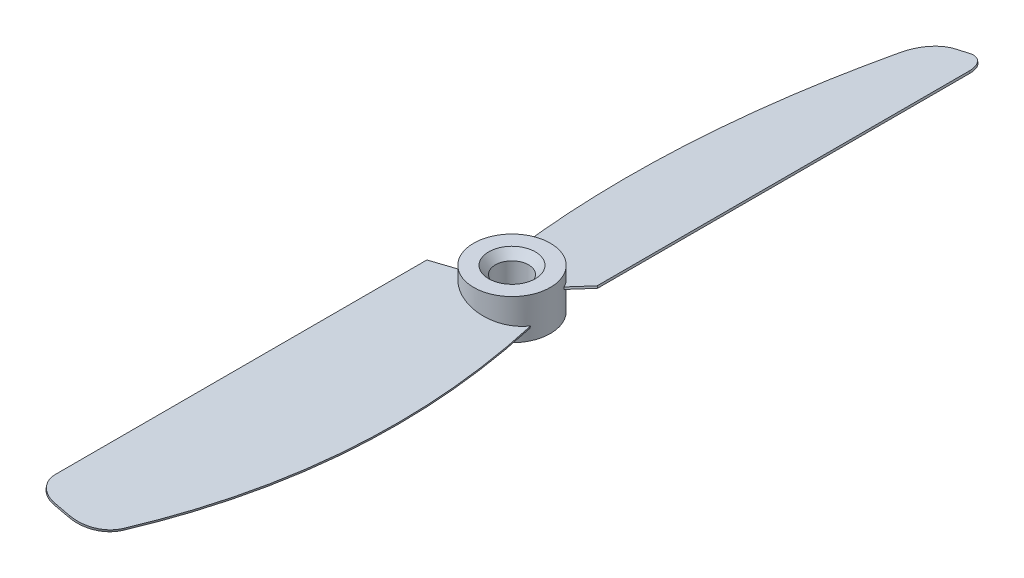
ISO-10303-21;
HEADER;
FILE_DESCRIPTION(('STEP AP214'),'2;1');
FILE_NAME('part.step','',(''),(''),'','','');
FILE_SCHEMA(('AUTOMOTIVE_DESIGN { 1 0 10303 214 1 1 1 1 }'));
ENDSEC;
DATA;
#1=APPLICATION_CONTEXT('core data for automotive mechanical design processes');
#2=APPLICATION_PROTOCOL_DEFINITION('international standard','automotive_design',2000,#1);
#3=PRODUCT_CONTEXT('',#1,'mechanical');
#4=PRODUCT('Part','Part','',(#3));
#5=PRODUCT_RELATED_PRODUCT_CATEGORY('part','',(#4));
#6=PRODUCT_DEFINITION_FORMATION('','',#4);
#7=PRODUCT_DEFINITION_CONTEXT('part definition',#1,'design');
#8=PRODUCT_DEFINITION('design','',#6,#7);
#9=PRODUCT_DEFINITION_SHAPE('','',#8);
#10=(LENGTH_UNIT() NAMED_UNIT(*) SI_UNIT(.MILLI.,.METRE.));
#11=(NAMED_UNIT(*) PLANE_ANGLE_UNIT() SI_UNIT($,.RADIAN.));
#12=(NAMED_UNIT(*) SI_UNIT($,.STERADIAN.) SOLID_ANGLE_UNIT());
#13=UNCERTAINTY_MEASURE_WITH_UNIT(LENGTH_MEASURE(1.E-05),#10,'distance_accuracy_value','');
#14=(GEOMETRIC_REPRESENTATION_CONTEXT(3) GLOBAL_UNCERTAINTY_ASSIGNED_CONTEXT((#13)) GLOBAL_UNIT_ASSIGNED_CONTEXT((#10,
#11,#12)) REPRESENTATION_CONTEXT('',''));
#15=CARTESIAN_POINT('',(0.,0.,0.));
#16=DIRECTION('',(0.,0.,1.));
#17=DIRECTION('',(1.,0.,0.));
#18=AXIS2_PLACEMENT_3D('',#15,#16,#17);
#19=CARTESIAN_POINT('',(0.,3.,0.));
#20=DIRECTION('',(0.,-1.,0.));
#21=DIRECTION('',(0.,0.,-1.));
#22=AXIS2_PLACEMENT_3D('',#19,#20,#21);
#23=CYLINDRICAL_SURFACE('',#22,5.75);
#24=CARTESIAN_POINT('',(-5.17321103617593,-1.34827549040175,-2.51005728524023));
#25=CARTESIAN_POINT('',(-5.18130724528555,-1.2987339238361,-2.49337560840791));
#26=CARTESIAN_POINT('',(-5.18936428493646,-1.24923107345242,-2.47656237967741));
#27=CARTESIAN_POINT('',(-5.20540002532086,-1.15030280504898,-2.44267281842004));
#28=CARTESIAN_POINT('',(-5.21337872605434,-1.10087738702923,-2.42559648589317));
#29=CARTESIAN_POINT('',(-5.22131825732912,-1.05149068519144,-2.40838860146813));
#30=B_SPLINE_CURVE_WITH_KNOTS('',3,(#24,#25,#26,#27,#28,#29),.UNSPECIFIED.,.F.,.F.,(4,2,4),(0.,
0.158692138114995,0.317384276229991),.UNSPECIFIED.);
#31=CARTESIAN_POINT('',(-5.17321103617593,-1.34827549040175,-2.51005728524023));
#32=VERTEX_POINT('',#31);
#33=CARTESIAN_POINT('',(-5.22131825732912,-1.05149068519145,-2.40838860146812));
#34=VERTEX_POINT('',#33);
#35=EDGE_CURVE('E51',#32,#34,#30,.T.);
#36=ORIENTED_EDGE('',*,*,#35,.F.);
#37=CARTESIAN_POINT('',(0.,-0.153945616169009,0.));
#38=DIRECTION('',(0.224951054343865,-0.974370064785235,0.));
#39=DIRECTION('',(-0.974370064785235,-0.224951054343865,0.));
#40=AXIS2_PLACEMENT_3D('',#37,#38,#39);
#41=ELLIPSE('',#40,5.901248619812,5.75);
#42=CARTESIAN_POINT('',(5.05271900090288,1.0125664798352,-2.74454562685976));
#43=VERTEX_POINT('',#42);
#44=EDGE_CURVE('E55',#32,#43,#41,.T.);
#45=ORIENTED_EDGE('',*,*,#44,.T.);
#46=CARTESIAN_POINT('',(0.,3.23855381107545,0.));
#47=DIRECTION('',(-0.513786863022175,-0.118617043690007,-0.849678207518632));
#48=DIRECTION('',(0.0613771970501858,-0.992940077218279,0.101502919839873));
#49=AXIS2_PLACEMENT_3D('',#46,#47,#48);
#50=ELLIPSE('',#49,48.4753271631605,5.75);
#51=CARTESIAN_POINT('',(5.0352757947948,1.31643063073162,-2.77641813680029));
#52=VERTEX_POINT('',#51);
#53=EDGE_CURVE('E214',#52,#43,#50,.T.);
#54=ORIENTED_EDGE('',*,*,#53,.F.);
#55=CARTESIAN_POINT('',(0.,0.153945616169009,0.));
#56=DIRECTION('',(0.224951054343865,-0.974370064785235,0.));
#57=DIRECTION('',(-0.974370064785235,-0.224951054343865,0.));
#58=AXIS2_PLACEMENT_3D('',#55,#56,#57);
#59=ELLIPSE('',#58,5.901248619812,5.75);
#60=EDGE_CURVE('E396',#34,#52,#59,.T.);
#61=ORIENTED_EDGE('',*,*,#60,.F.);
#62=EDGE_LOOP('',(#36,#45,#54,#61));
#63=FACE_BOUND('',#62,.T.);
#64=CARTESIAN_POINT('',(5.17321103617593,-1.34827549040175,2.51005728524023));
#65=CARTESIAN_POINT('',(5.18130724528555,-1.2987339238361,2.49337560840791));
#66=CARTESIAN_POINT('',(5.18936428493646,-1.24923107345242,2.47656237967741));
#67=CARTESIAN_POINT('',(5.20540002532086,-1.15030280504898,2.44267281842004));
#68=CARTESIAN_POINT('',(5.21337872605434,-1.10087738702923,2.42559648589317));
#69=CARTESIAN_POINT('',(5.22131825732912,-1.05149068519144,2.40838860146813));
#70=B_SPLINE_CURVE_WITH_KNOTS('',3,(#64,#65,#66,#67,#68,#69),.UNSPECIFIED.,.F.,.F.,(4,2,4),(0.,
0.158692138114995,0.317384276229991),.UNSPECIFIED.);
#71=CARTESIAN_POINT('',(5.17321103617593,-1.34827549040175,2.51005728524023));
#72=VERTEX_POINT('',#71);
#73=CARTESIAN_POINT('',(5.22131825732912,-1.05149068519145,2.40838860146812));
#74=VERTEX_POINT('',#73);
#75=EDGE_CURVE('E189',#72,#74,#70,.T.);
#76=ORIENTED_EDGE('',*,*,#75,.F.);
#77=CARTESIAN_POINT('',(0.,-0.153945616169009,0.));
#78=DIRECTION('',(-0.224951054343865,-0.974370064785235,0.));
#79=DIRECTION('',(0.974370064785235,-0.224951054343865,0.));
#80=AXIS2_PLACEMENT_3D('',#77,#78,#79);
#81=ELLIPSE('',#80,5.901248619812,5.75);
#82=CARTESIAN_POINT('',(-5.05271900090288,1.0125664798352,2.74454562685976));
#83=VERTEX_POINT('',#82);
#84=EDGE_CURVE('E198',#72,#83,#81,.T.);
#85=ORIENTED_EDGE('',*,*,#84,.T.);
#86=CARTESIAN_POINT('',(0.,3.23855381107545,0.));
#87=DIRECTION('',(0.513786863022175,-0.118617043690007,0.849678207518632));
#88=DIRECTION('',(-0.0613771970501858,-0.992940077218279,-0.101502919839873));
#89=AXIS2_PLACEMENT_3D('',#86,#87,#88);
#90=ELLIPSE('',#89,48.4753271631605,5.75);
#91=CARTESIAN_POINT('',(-5.0352757947948,1.31643063073162,2.77641813680029));
#92=VERTEX_POINT('',#91);
#93=EDGE_CURVE('E199',#92,#83,#90,.T.);
#94=ORIENTED_EDGE('',*,*,#93,.F.);
#95=CARTESIAN_POINT('',(0.,0.153945616169009,0.));
#96=DIRECTION('',(-0.224951054343865,-0.974370064785235,0.));
#97=DIRECTION('',(0.974370064785235,-0.224951054343865,0.));
#98=AXIS2_PLACEMENT_3D('',#95,#96,#97);
#99=ELLIPSE('',#98,5.901248619812,5.75);
#100=EDGE_CURVE('E322',#74,#92,#99,.T.);
#101=ORIENTED_EDGE('',*,*,#100,.F.);
#102=EDGE_LOOP('',(#76,#85,#94,#101));
#103=FACE_BOUND('',#102,.T.);
#104=CARTESIAN_POINT('',(0.,3.,0.));
#105=DIRECTION('',(0.,1.,0.));
#106=DIRECTION('',(0.,0.,1.));
#107=AXIS2_PLACEMENT_3D('',#104,#105,#106);
#108=CIRCLE('',#107,5.75);
#109=CARTESIAN_POINT('',(0.,3.,5.75));
#110=VERTEX_POINT('',#109);
#111=EDGE_CURVE('E320',#110,#110,#108,.T.);
#112=ORIENTED_EDGE('',*,*,#111,.F.);
#113=EDGE_LOOP('',(#112));
#114=FACE_BOUND('',#113,.T.);
#115=CARTESIAN_POINT('',(0.,-3.,0.));
#116=DIRECTION('',(0.,1.,0.));
#117=DIRECTION('',(0.,0.,1.));
#118=AXIS2_PLACEMENT_3D('',#115,#116,#117);
#119=CIRCLE('',#118,5.75);
#120=CARTESIAN_POINT('',(0.,-3.,5.75));
#121=VERTEX_POINT('',#120);
#122=EDGE_CURVE('E323',#121,#121,#119,.T.);
#123=ORIENTED_EDGE('',*,*,#122,.T.);
#124=EDGE_LOOP('',(#123));
#125=FACE_BOUND('',#124,.T.);
#126=ADVANCED_FACE('F36',(#63,#103,#114,#125),#23,.T.);
#127=CARTESIAN_POINT('',(0.,3.,0.));
#128=DIRECTION('',(0.,1.,0.));
#129=DIRECTION('',(0.,0.,1.));
#130=AXIS2_PLACEMENT_3D('',#127,#128,#129);
#131=PLANE('',#130);
#132=CARTESIAN_POINT('',(0.,3.,0.));
#133=DIRECTION('',(0.,1.,0.));
#134=DIRECTION('',(0.,0.,1.));
#135=AXIS2_PLACEMENT_3D('',#132,#133,#134);
#136=CIRCLE('',#135,3.49999999999999);
#137=CARTESIAN_POINT('',(0.,3.,3.49999999999999));
#138=VERTEX_POINT('',#137);
#139=EDGE_CURVE('E44',#138,#138,#136,.F.);
#140=ORIENTED_EDGE('',*,*,#139,.T.);
#141=EDGE_LOOP('',(#140));
#142=FACE_BOUND('',#141,.T.);
#143=ORIENTED_EDGE('',*,*,#111,.T.);
#144=EDGE_LOOP('',(#143));
#145=FACE_BOUND('',#144,.T.);
#146=ADVANCED_FACE('F186',(#142,#145),#131,.T.);
#147=CARTESIAN_POINT('',(0.,-3.,0.));
#148=DIRECTION('',(0.,1.,0.));
#149=DIRECTION('',(0.,0.,1.));
#150=AXIS2_PLACEMENT_3D('',#147,#148,#149);
#151=PLANE('',#150);
#152=CARTESIAN_POINT('',(0.,-3.,0.));
#153=DIRECTION('',(0.,1.,0.));
#154=DIRECTION('',(0.,0.,1.));
#155=AXIS2_PLACEMENT_3D('',#152,#153,#154);
#156=CIRCLE('',#155,3.69175359259423);
#157=CARTESIAN_POINT('',(0.,-3.,3.69175359259423));
#158=VERTEX_POINT('',#157);
#159=EDGE_CURVE('E11',#158,#158,#156,.T.);
#160=ORIENTED_EDGE('',*,*,#159,.T.);
#161=EDGE_LOOP('',(#160));
#162=FACE_BOUND('',#161,.T.);
#163=ORIENTED_EDGE('',*,*,#122,.F.);
#164=EDGE_LOOP('',(#163));
#165=FACE_BOUND('',#164,.T.);
#166=ADVANCED_FACE('F183',(#162,#165),#151,.F.);
#167=CARTESIAN_POINT('',(4.84553663689776,-1.27262589456224,0.848133107980154));
#168=CARTESIAN_POINT('',(10.9819459688261,-2.68932761703057,30.9060678712532));
#169=CARTESIAN_POINT('',(1.73622060139535,-0.554783725808093,59.9727073216359));
#170=B_SPLINE_CURVE_WITH_KNOTS('',2,(#167,#168,#169),.UNSPECIFIED.,.F.,.F.,(3,3),(0.,1.),.UNSPECIFIED.);
#171=DIRECTION('',(0.224951054343865,0.974370064785235,0.));
#172=VECTOR('',#171,1.);
#173=SURFACE_OF_LINEAR_EXTRUSION('',#170,#172);
#174=CARTESIAN_POINT('',(1.73622060139535,-0.554783725808092,59.9727073216359));
#175=VERTEX_POINT('',#174);
#176=EDGE_CURVE('E165',#72,#175,#170,.T.);
#177=ORIENTED_EDGE('',*,*,#176,.F.);
#178=ORIENTED_EDGE('',*,*,#75,.T.);
#179=CARTESIAN_POINT('',(4.91302195320092,-0.98031487512667,0.848133107980154));
#180=CARTESIAN_POINT('',(11.0494312851293,-2.397016597595,30.9060678712532));
#181=CARTESIAN_POINT('',(1.80370591769851,-0.262472706372522,59.9727073216359));
#182=B_SPLINE_CURVE_WITH_KNOTS('',2,(#179,#180,#181),.UNSPECIFIED.,.F.,.F.,(3,3),(0.,1.),.UNSPECIFIED.);
#183=CARTESIAN_POINT('',(1.80370591769851,-0.262472706372522,59.9727073216359));
#184=VERTEX_POINT('',#183);
#185=EDGE_CURVE('E157',#74,#184,#182,.T.);
#186=ORIENTED_EDGE('',*,*,#185,.T.);
#187=DIRECTION('',(0.224951054343865,0.974370064785235,0.));
#188=VECTOR('',#187,1.);
#189=CARTESIAN_POINT('',(1.73622060139535,-0.554783725808092,59.9727073216359));
#190=LINE('',#189,#188);
#191=EDGE_CURVE('E327',#175,#184,#190,.T.);
#192=ORIENTED_EDGE('',*,*,#191,.F.);
#193=EDGE_LOOP('',(#177,#178,#186,#192));
#194=FACE_BOUND('',#193,.T.);
#195=ADVANCED_FACE('F177',(#194),#173,.F.);
#196=CARTESIAN_POINT('',(-2.91950811093368,0.520075940378662,58.5));
#197=DIRECTION('',(0.224951054343865,0.974370064785235,0.));
#198=DIRECTION('',(-0.974370064785235,0.224951054343865,0.));
#199=AXIS2_PLACEMENT_3D('',#196,#197,#198);
#200=CYLINDRICAL_SURFACE('',#199,5.);
#201=CARTESIAN_POINT('',(-2.85202279463052,0.812386959814232,58.5));
#202=DIRECTION('',(-0.224951054343866,-0.974370064785235,0.));
#203=DIRECTION('',(0.974370064785235,-0.224951054343866,0.));
#204=AXIS2_PLACEMENT_3D('',#201,#202,#203);
#205=CIRCLE('',#204,5.);
#206=CARTESIAN_POINT('',(-2.85202279463053,0.812386959814233,63.5));
#207=VERTEX_POINT('',#206);
#208=EDGE_CURVE('E159',#184,#207,#205,.T.);
#209=ORIENTED_EDGE('',*,*,#208,.T.);
#210=DIRECTION('',(0.224951054343865,0.974370064785235,0.));
#211=VECTOR('',#210,1.);
#212=CARTESIAN_POINT('',(-2.91950811093368,0.520075940378662,63.5));
#213=LINE('',#212,#211);
#214=CARTESIAN_POINT('',(-2.91950811093368,0.520075940378662,63.5));
#215=VERTEX_POINT('',#214);
#216=EDGE_CURVE('E332',#215,#207,#213,.T.);
#217=ORIENTED_EDGE('',*,*,#216,.F.);
#218=CARTESIAN_POINT('',(-2.91950811093368,0.520075940378662,58.5));
#219=DIRECTION('',(-0.224951054343866,-0.974370064785235,0.));
#220=DIRECTION('',(0.974370064785235,-0.224951054343866,0.));
#221=AXIS2_PLACEMENT_3D('',#218,#219,#220);
#222=CIRCLE('',#221,5.);
#223=EDGE_CURVE('E170',#175,#215,#222,.T.);
#224=ORIENTED_EDGE('',*,*,#223,.F.);
#225=ORIENTED_EDGE('',*,*,#191,.T.);
#226=EDGE_LOOP('',(#209,#217,#224,#225));
#227=FACE_BOUND('',#226,.T.);
#228=ADVANCED_FACE('F182',(#227),#200,.T.);
#229=CARTESIAN_POINT('',(-5.20802828433935,1.04842245316719,63.5));
#230=DIRECTION('',(0.,0.,-1.));
#231=DIRECTION('',(-1.,0.,0.));
#232=AXIS2_PLACEMENT_3D('',#229,#230,#231);
#233=PLANE('',#232);
#234=DIRECTION('',(-0.974370064785235,0.224951054343865,0.));
#235=VECTOR('',#234,1.);
#236=CARTESIAN_POINT('',(-5.14054296803619,1.34073347260276,63.5));
#237=LINE('',#236,#235);
#238=CARTESIAN_POINT('',(-5.14054296803619,1.34073347260276,63.5));
#239=VERTEX_POINT('',#238);
#240=EDGE_CURVE('E351',#207,#239,#237,.T.);
#241=ORIENTED_EDGE('',*,*,#240,.T.);
#242=DIRECTION('',(0.224951054343865,0.974370064785235,0.));
#243=VECTOR('',#242,1.);
#244=CARTESIAN_POINT('',(-5.20802828433935,1.04842245316719,63.5));
#245=LINE('',#244,#243);
#246=CARTESIAN_POINT('',(-5.20802828433935,1.04842245316719,63.5));
#247=VERTEX_POINT('',#246);
#248=EDGE_CURVE('E335',#247,#239,#245,.T.);
#249=ORIENTED_EDGE('',*,*,#248,.F.);
#250=DIRECTION('',(-0.974370064785235,0.224951054343865,0.));
#251=VECTOR('',#250,1.);
#252=CARTESIAN_POINT('',(-5.20802828433935,1.04842245316719,63.5));
#253=LINE('',#252,#251);
#254=EDGE_CURVE('E364',#215,#247,#253,.T.);
#255=ORIENTED_EDGE('',*,*,#254,.F.);
#256=ORIENTED_EDGE('',*,*,#216,.T.);
#257=EDGE_LOOP('',(#241,#249,#255,#256));
#258=FACE_BOUND('',#257,.T.);
#259=ADVANCED_FACE('F377',(#258),#233,.F.);
#260=CARTESIAN_POINT('',(-5.20802828433937,1.04842245316719,60.5));
#261=DIRECTION('',(0.224951054343865,0.974370064785235,0.));
#262=DIRECTION('',(-0.974370064785235,0.224951054343865,0.));
#263=AXIS2_PLACEMENT_3D('',#260,#261,#262);
#264=CYLINDRICAL_SURFACE('',#263,3.);
#265=CARTESIAN_POINT('',(-5.14054296803621,1.34073347260276,60.5));
#266=DIRECTION('',(-0.224951054343866,-0.974370064785235,0.));
#267=DIRECTION('',(-0.974370064785235,0.224951054343866,0.));
#268=AXIS2_PLACEMENT_3D('',#265,#266,#267);
#269=CIRCLE('',#268,3.);
#270=CARTESIAN_POINT('',(-8.06365316239191,2.01558663563436,60.5));
#271=VERTEX_POINT('',#270);
#272=EDGE_CURVE('E349',#239,#271,#269,.T.);
#273=ORIENTED_EDGE('',*,*,#272,.T.);
#274=DIRECTION('',(0.224951054343865,0.974370064785235,0.));
#275=VECTOR('',#274,1.);
#276=CARTESIAN_POINT('',(-8.13113847869507,1.72327561619879,60.5));
#277=LINE('',#276,#275);
#278=CARTESIAN_POINT('',(-8.13113847869507,1.72327561619879,60.5));
#279=VERTEX_POINT('',#278);
#280=EDGE_CURVE('E338',#279,#271,#277,.T.);
#281=ORIENTED_EDGE('',*,*,#280,.F.);
#282=CARTESIAN_POINT('',(-5.20802828433937,1.04842245316719,60.5));
#283=DIRECTION('',(-0.224951054343866,-0.974370064785235,0.));
#284=DIRECTION('',(-0.974370064785235,0.224951054343866,0.));
#285=AXIS2_PLACEMENT_3D('',#282,#283,#284);
#286=CIRCLE('',#285,3.);
#287=EDGE_CURVE('E363',#247,#279,#286,.T.);
#288=ORIENTED_EDGE('',*,*,#287,.F.);
#289=ORIENTED_EDGE('',*,*,#248,.T.);
#290=EDGE_LOOP('',(#273,#281,#288,#289));
#291=FACE_BOUND('',#290,.T.);
#292=ADVANCED_FACE('F382',(#291),#264,.T.);
#293=CARTESIAN_POINT('',(-8.13113847869507,1.72327561619879,4.70523343607794));
#294=DIRECTION('',(0.974370064785235,-0.224951054343865,0.));
#295=DIRECTION('',(0.224951054343865,0.974370064785235,0.));
#296=AXIS2_PLACEMENT_3D('',#293,#294,#295);
#297=PLANE('',#296);
#298=DIRECTION('',(0.,0.,-1.));
#299=VECTOR('',#298,1.);
#300=CARTESIAN_POINT('',(-8.06365316239191,2.01558663563436,4.70523343607794));
#301=LINE('',#300,#299);
#302=CARTESIAN_POINT('',(-8.06365316239191,2.01558663563436,4.70523343607794));
#303=VERTEX_POINT('',#302);
#304=EDGE_CURVE('E347',#271,#303,#301,.T.);
#305=ORIENTED_EDGE('',*,*,#304,.T.);
#306=DIRECTION('',(0.224951054343865,0.974370064785235,0.));
#307=VECTOR('',#306,1.);
#308=CARTESIAN_POINT('',(-8.13113847869507,1.72327561619879,4.70523343607794));
#309=LINE('',#308,#307);
#310=CARTESIAN_POINT('',(-8.13113847869507,1.72327561619879,4.70523343607794));
#311=VERTEX_POINT('',#310);
#312=EDGE_CURVE('E341',#311,#303,#309,.T.);
#313=ORIENTED_EDGE('',*,*,#312,.F.);
#314=DIRECTION('',(0.,0.,-1.));
#315=VECTOR('',#314,1.);
#316=CARTESIAN_POINT('',(-8.13113847869507,1.72327561619879,4.70523343607794));
#317=LINE('',#316,#315);
#318=EDGE_CURVE('E361',#279,#311,#317,.T.);
#319=ORIENTED_EDGE('',*,*,#318,.F.);
#320=ORIENTED_EDGE('',*,*,#280,.T.);
#321=EDGE_LOOP('',(#305,#313,#319,#320));
#322=FACE_BOUND('',#321,.T.);
#323=ADVANCED_FACE('F387',(#322),#297,.F.);
#324=CARTESIAN_POINT('',(-4.37429716173756,0.85594045700703,2.31244940373139));
#325=DIRECTION('',(0.513786863022175,-0.118617043690007,0.849678207518632));
#326=DIRECTION('',(0.85571952126155,0.,-0.517439949107048));
#327=AXIS2_PLACEMENT_3D('',#324,#325,#326);
#328=PLANE('',#327);
#329=DIRECTION('',(0.827901010106532,-0.191136008634322,-0.527301568049939));
#330=VECTOR('',#329,1.);
#331=CARTESIAN_POINT('',(-4.3068118454344,1.1482514764426,2.31244940373139));
#332=LINE('',#331,#330);
#333=EDGE_CURVE('E171',#303,#92,#332,.T.);
#334=ORIENTED_EDGE('',*,*,#333,.T.);
#335=ORIENTED_EDGE('',*,*,#93,.T.);
#336=DIRECTION('',(0.827901010106532,-0.191136008634322,-0.527301568049939));
#337=VECTOR('',#336,1.);
#338=CARTESIAN_POINT('',(-4.37429716173756,0.85594045700703,2.31244940373139));
#339=LINE('',#338,#337);
#340=EDGE_CURVE('E344',#311,#83,#339,.T.);
#341=ORIENTED_EDGE('',*,*,#340,.F.);
#342=ORIENTED_EDGE('',*,*,#312,.T.);
#343=EDGE_LOOP('',(#334,#335,#341,#342));
#344=FACE_BOUND('',#343,.T.);
#345=ADVANCED_FACE('F392',(#344),#328,.F.);
#346=CARTESIAN_POINT('',(7.13641229398633,-1.80151621360787,30.6582440430306));
#347=DIRECTION('',(-0.224951054343865,-0.974370064785235,0.));
#348=DIRECTION('',(0.974370064785235,-0.224951054343865,0.));
#349=AXIS2_PLACEMENT_3D('',#346,#347,#348);
#350=PLANE('',#349);
#351=ORIENTED_EDGE('',*,*,#84,.F.);
#352=ORIENTED_EDGE('',*,*,#176,.T.);
#353=ORIENTED_EDGE('',*,*,#223,.T.);
#354=ORIENTED_EDGE('',*,*,#254,.T.);
#355=ORIENTED_EDGE('',*,*,#287,.T.);
#356=ORIENTED_EDGE('',*,*,#318,.T.);
#357=ORIENTED_EDGE('',*,*,#340,.T.);
#358=EDGE_LOOP('',(#351,#352,#353,#354,#355,#356,#357));
#359=FACE_BOUND('',#358,.T.);
#360=ADVANCED_FACE('F222',(#359),#350,.T.);
#361=CARTESIAN_POINT('',(7.20389761028949,-1.5092051941723,30.6582440430306));
#362=DIRECTION('',(-0.224951054343865,-0.974370064785235,0.));
#363=DIRECTION('',(0.974370064785235,-0.224951054343865,0.));
#364=AXIS2_PLACEMENT_3D('',#361,#362,#363);
#365=PLANE('',#364);
#366=ORIENTED_EDGE('',*,*,#185,.F.);
#367=ORIENTED_EDGE('',*,*,#100,.T.);
#368=ORIENTED_EDGE('',*,*,#333,.F.);
#369=ORIENTED_EDGE('',*,*,#304,.F.);
#370=ORIENTED_EDGE('',*,*,#272,.F.);
#371=ORIENTED_EDGE('',*,*,#240,.F.);
#372=ORIENTED_EDGE('',*,*,#208,.F.);
#373=EDGE_LOOP('',(#366,#367,#368,#369,#370,#371,#372));
#374=FACE_BOUND('',#373,.T.);
#375=ADVANCED_FACE('F220',(#374),#365,.F.);
#376=CARTESIAN_POINT('',(-4.84553663689776,-1.27262589456224,-0.848133107980154));
#377=CARTESIAN_POINT('',(-10.9819459688261,-2.68932761703057,-30.9060678712532));
#378=CARTESIAN_POINT('',(-1.73622060139535,-0.554783725808093,-59.9727073216359));
#379=B_SPLINE_CURVE_WITH_KNOTS('',2,(#376,#377,#378),.UNSPECIFIED.,.F.,.F.,(3,3),(0.,1.),.UNSPECIFIED.);
#380=DIRECTION('',(-0.224951054343865,0.974370064785235,0.));
#381=VECTOR('',#380,1.);
#382=SURFACE_OF_LINEAR_EXTRUSION('',#379,#381);
#383=CARTESIAN_POINT('',(-1.73622060139535,-0.554783725808092,-59.9727073216359));
#384=VERTEX_POINT('',#383);
#385=EDGE_CURVE('E134',#32,#384,#379,.T.);
#386=ORIENTED_EDGE('',*,*,#385,.F.);
#387=ORIENTED_EDGE('',*,*,#35,.T.);
#388=CARTESIAN_POINT('',(-4.91302195320092,-0.98031487512667,-0.848133107980154));
#389=CARTESIAN_POINT('',(-11.0494312851293,-2.397016597595,-30.9060678712532));
#390=CARTESIAN_POINT('',(-1.80370591769851,-0.262472706372522,-59.9727073216359));
#391=B_SPLINE_CURVE_WITH_KNOTS('',2,(#388,#389,#390),.UNSPECIFIED.,.F.,.F.,(3,3),(0.,1.),.UNSPECIFIED.);
#392=CARTESIAN_POINT('',(-1.80370591769851,-0.262472706372522,-59.9727073216359));
#393=VERTEX_POINT('',#392);
#394=EDGE_CURVE('E155',#34,#393,#391,.T.);
#395=ORIENTED_EDGE('',*,*,#394,.T.);
#396=DIRECTION('',(-0.224951054343865,0.974370064785235,0.));
#397=VECTOR('',#396,1.);
#398=CARTESIAN_POINT('',(-1.73622060139535,-0.554783725808092,-59.9727073216359));
#399=LINE('',#398,#397);
#400=EDGE_CURVE('E147',#384,#393,#399,.T.);
#401=ORIENTED_EDGE('',*,*,#400,.F.);
#402=EDGE_LOOP('',(#386,#387,#395,#401));
#403=FACE_BOUND('',#402,.T.);
#404=ADVANCED_FACE('F153',(#403),#382,.F.);
#405=CARTESIAN_POINT('',(2.91950811093368,0.520075940378662,-58.5));
#406=DIRECTION('',(-0.224951054343865,0.974370064785235,0.));
#407=DIRECTION('',(-0.974370064785235,-0.224951054343865,0.));
#408=AXIS2_PLACEMENT_3D('',#405,#406,#407);
#409=CYLINDRICAL_SURFACE('',#408,5.);
#410=CARTESIAN_POINT('',(2.85202279463052,0.812386959814232,-58.5));
#411=DIRECTION('',(0.224951054343866,-0.974370064785235,0.));
#412=DIRECTION('',(-0.974370064785235,-0.224951054343866,0.));
#413=AXIS2_PLACEMENT_3D('',#410,#411,#412);
#414=CIRCLE('',#413,5.);
#415=CARTESIAN_POINT('',(2.85202279463053,0.812386959814233,-63.5));
#416=VERTEX_POINT('',#415);
#417=EDGE_CURVE('E242',#393,#416,#414,.T.);
#418=ORIENTED_EDGE('',*,*,#417,.T.);
#419=DIRECTION('',(-0.224951054343865,0.974370064785235,0.));
#420=VECTOR('',#419,1.);
#421=CARTESIAN_POINT('',(2.91950811093368,0.520075940378662,-63.5));
#422=LINE('',#421,#420);
#423=CARTESIAN_POINT('',(2.91950811093368,0.520075940378662,-63.5));
#424=VERTEX_POINT('',#423);
#425=EDGE_CURVE('E149',#424,#416,#422,.T.);
#426=ORIENTED_EDGE('',*,*,#425,.F.);
#427=CARTESIAN_POINT('',(2.91950811093368,0.520075940378662,-58.5));
#428=DIRECTION('',(0.224951054343866,-0.974370064785235,0.));
#429=DIRECTION('',(-0.974370064785235,-0.224951054343866,0.));
#430=AXIS2_PLACEMENT_3D('',#427,#428,#429);
#431=CIRCLE('',#430,5.);
#432=EDGE_CURVE('E137',#384,#424,#431,.T.);
#433=ORIENTED_EDGE('',*,*,#432,.F.);
#434=ORIENTED_EDGE('',*,*,#400,.T.);
#435=EDGE_LOOP('',(#418,#426,#433,#434));
#436=FACE_BOUND('',#435,.T.);
#437=ADVANCED_FACE('F146',(#436),#409,.T.);
#438=CARTESIAN_POINT('',(5.20802828433935,1.04842245316719,-63.5));
#439=DIRECTION('',(0.,0.,1.));
#440=DIRECTION('',(1.,0.,0.));
#441=AXIS2_PLACEMENT_3D('',#438,#439,#440);
#442=PLANE('',#441);
#443=DIRECTION('',(0.974370064785235,0.224951054343865,0.));
#444=VECTOR('',#443,1.);
#445=CARTESIAN_POINT('',(5.14054296803619,1.34073347260276,-63.5));
#446=LINE('',#445,#444);
#447=CARTESIAN_POINT('',(5.14054296803619,1.34073347260276,-63.5));
#448=VERTEX_POINT('',#447);
#449=EDGE_CURVE('E247',#416,#448,#446,.T.);
#450=ORIENTED_EDGE('',*,*,#449,.T.);
#451=DIRECTION('',(-0.224951054343865,0.974370064785235,0.));
#452=VECTOR('',#451,1.);
#453=CARTESIAN_POINT('',(5.20802828433935,1.04842245316719,-63.5));
#454=LINE('',#453,#452);
#455=CARTESIAN_POINT('',(5.20802828433935,1.04842245316719,-63.5));
#456=VERTEX_POINT('',#455);
#457=EDGE_CURVE('E161',#456,#448,#454,.T.);
#458=ORIENTED_EDGE('',*,*,#457,.F.);
#459=DIRECTION('',(0.974370064785235,0.224951054343865,0.));
#460=VECTOR('',#459,1.);
#461=CARTESIAN_POINT('',(5.20802828433935,1.04842245316719,-63.5));
#462=LINE('',#461,#460);
#463=EDGE_CURVE('E151',#424,#456,#462,.T.);
#464=ORIENTED_EDGE('',*,*,#463,.F.);
#465=ORIENTED_EDGE('',*,*,#425,.T.);
#466=EDGE_LOOP('',(#450,#458,#464,#465));
#467=FACE_BOUND('',#466,.T.);
#468=ADVANCED_FACE('F280',(#467),#442,.F.);
#469=CARTESIAN_POINT('',(5.20802828433937,1.04842245316719,-60.5));
#470=DIRECTION('',(-0.224951054343865,0.974370064785235,0.));
#471=DIRECTION('',(-0.974370064785235,-0.224951054343865,0.));
#472=AXIS2_PLACEMENT_3D('',#469,#470,#471);
#473=CYLINDRICAL_SURFACE('',#472,3.);
#474=CARTESIAN_POINT('',(5.14054296803621,1.34073347260276,-60.5));
#475=DIRECTION('',(0.224951054343866,-0.974370064785235,0.));
#476=DIRECTION('',(0.974370064785235,0.224951054343866,0.));
#477=AXIS2_PLACEMENT_3D('',#474,#475,#476);
#478=CIRCLE('',#477,3.);
#479=CARTESIAN_POINT('',(8.06365316239191,2.01558663563436,-60.5));
#480=VERTEX_POINT('',#479);
#481=EDGE_CURVE('E249',#448,#480,#478,.T.);
#482=ORIENTED_EDGE('',*,*,#481,.T.);
#483=DIRECTION('',(-0.224951054343865,0.974370064785235,0.));
#484=VECTOR('',#483,1.);
#485=CARTESIAN_POINT('',(8.13113847869507,1.72327561619879,-60.5));
#486=LINE('',#485,#484);
#487=CARTESIAN_POINT('',(8.13113847869507,1.72327561619879,-60.5));
#488=VERTEX_POINT('',#487);
#489=EDGE_CURVE('E257',#488,#480,#486,.T.);
#490=ORIENTED_EDGE('',*,*,#489,.F.);
#491=CARTESIAN_POINT('',(5.20802828433937,1.04842245316719,-60.5));
#492=DIRECTION('',(0.224951054343866,-0.974370064785235,0.));
#493=DIRECTION('',(0.974370064785235,0.224951054343866,0.));
#494=AXIS2_PLACEMENT_3D('',#491,#492,#493);
#495=CIRCLE('',#494,3.);
#496=EDGE_CURVE('E232',#456,#488,#495,.T.);
#497=ORIENTED_EDGE('',*,*,#496,.F.);
#498=ORIENTED_EDGE('',*,*,#457,.T.);
#499=EDGE_LOOP('',(#482,#490,#497,#498));
#500=FACE_BOUND('',#499,.T.);
#501=ADVANCED_FACE('F264',(#500),#473,.T.);
#502=CARTESIAN_POINT('',(8.13113847869507,1.72327561619879,-4.70523343607794));
#503=DIRECTION('',(-0.974370064785235,-0.224951054343865,0.));
#504=DIRECTION('',(0.224951054343865,-0.974370064785235,0.));
#505=AXIS2_PLACEMENT_3D('',#502,#503,#504);
#506=PLANE('',#505);
#507=DIRECTION('',(0.,0.,1.));
#508=VECTOR('',#507,1.);
#509=CARTESIAN_POINT('',(8.06365316239191,2.01558663563436,-4.70523343607794));
#510=LINE('',#509,#508);
#511=CARTESIAN_POINT('',(8.06365316239191,2.01558663563436,-4.70523343607794));
#512=VERTEX_POINT('',#511);
#513=EDGE_CURVE('E251',#480,#512,#510,.T.);
#514=ORIENTED_EDGE('',*,*,#513,.T.);
#515=DIRECTION('',(-0.224951054343865,0.974370064785235,0.));
#516=VECTOR('',#515,1.);
#517=CARTESIAN_POINT('',(8.13113847869507,1.72327561619879,-4.70523343607794));
#518=LINE('',#517,#516);
#519=CARTESIAN_POINT('',(8.13113847869507,1.72327561619879,-4.70523343607794));
#520=VERTEX_POINT('',#519);
#521=EDGE_CURVE('E238',#520,#512,#518,.T.);
#522=ORIENTED_EDGE('',*,*,#521,.F.);
#523=DIRECTION('',(0.,0.,1.));
#524=VECTOR('',#523,1.);
#525=CARTESIAN_POINT('',(8.13113847869507,1.72327561619879,-4.70523343607794));
#526=LINE('',#525,#524);
#527=EDGE_CURVE('E234',#488,#520,#526,.T.);
#528=ORIENTED_EDGE('',*,*,#527,.F.);
#529=ORIENTED_EDGE('',*,*,#489,.T.);
#530=EDGE_LOOP('',(#514,#522,#528,#529));
#531=FACE_BOUND('',#530,.T.);
#532=ADVANCED_FACE('F275',(#531),#506,.F.);
#533=CARTESIAN_POINT('',(4.37429716173756,0.85594045700703,-2.31244940373139));
#534=DIRECTION('',(-0.513786863022175,-0.118617043690007,-0.849678207518632));
#535=DIRECTION('',(-0.85571952126155,0.,0.517439949107048));
#536=AXIS2_PLACEMENT_3D('',#533,#534,#535);
#537=PLANE('',#536);
#538=DIRECTION('',(-0.827901010106532,-0.191136008634322,0.527301568049939));
#539=VECTOR('',#538,1.);
#540=CARTESIAN_POINT('',(4.3068118454344,1.1482514764426,-2.31244940373139));
#541=LINE('',#540,#539);
#542=EDGE_CURVE('E142',#512,#52,#541,.T.);
#543=ORIENTED_EDGE('',*,*,#542,.T.);
#544=ORIENTED_EDGE('',*,*,#53,.T.);
#545=DIRECTION('',(-0.827901010106532,-0.191136008634322,0.527301568049939));
#546=VECTOR('',#545,1.);
#547=CARTESIAN_POINT('',(4.37429716173756,0.85594045700703,-2.31244940373139));
#548=LINE('',#547,#546);
#549=EDGE_CURVE('E236',#520,#43,#548,.T.);
#550=ORIENTED_EDGE('',*,*,#549,.F.);
#551=ORIENTED_EDGE('',*,*,#521,.T.);
#552=EDGE_LOOP('',(#543,#544,#550,#551));
#553=FACE_BOUND('',#552,.T.);
#554=ADVANCED_FACE('F279',(#553),#537,.F.);
#555=CARTESIAN_POINT('',(-7.13641229398633,-1.80151621360787,-30.6582440430306));
#556=DIRECTION('',(0.224951054343865,-0.974370064785235,0.));
#557=DIRECTION('',(-0.974370064785235,-0.224951054343865,0.));
#558=AXIS2_PLACEMENT_3D('',#555,#556,#557);
#559=PLANE('',#558);
#560=ORIENTED_EDGE('',*,*,#44,.F.);
#561=ORIENTED_EDGE('',*,*,#385,.T.);
#562=ORIENTED_EDGE('',*,*,#432,.T.);
#563=ORIENTED_EDGE('',*,*,#463,.T.);
#564=ORIENTED_EDGE('',*,*,#496,.T.);
#565=ORIENTED_EDGE('',*,*,#527,.T.);
#566=ORIENTED_EDGE('',*,*,#549,.T.);
#567=EDGE_LOOP('',(#560,#561,#562,#563,#564,#565,#566));
#568=FACE_BOUND('',#567,.T.);
#569=ADVANCED_FACE('F136',(#568),#559,.T.);
#570=CARTESIAN_POINT('',(-7.20389761028949,-1.5092051941723,-30.6582440430306));
#571=DIRECTION('',(0.224951054343865,-0.974370064785235,0.));
#572=DIRECTION('',(-0.974370064785235,-0.224951054343865,0.));
#573=AXIS2_PLACEMENT_3D('',#570,#571,#572);
#574=PLANE('',#573);
#575=ORIENTED_EDGE('',*,*,#394,.F.);
#576=ORIENTED_EDGE('',*,*,#60,.T.);
#577=ORIENTED_EDGE('',*,*,#542,.F.);
#578=ORIENTED_EDGE('',*,*,#513,.F.);
#579=ORIENTED_EDGE('',*,*,#481,.F.);
#580=ORIENTED_EDGE('',*,*,#449,.F.);
#581=ORIENTED_EDGE('',*,*,#417,.F.);
#582=EDGE_LOOP('',(#575,#576,#577,#578,#579,#580,#581));
#583=FACE_BOUND('',#582,.T.);
#584=ADVANCED_FACE('F270',(#583),#574,.F.);
#585=CARTESIAN_POINT('',(0.,-3.,0.));
#586=DIRECTION('',(0.,1.,0.));
#587=DIRECTION('',(0.,0.,1.));
#588=AXIS2_PLACEMENT_3D('',#585,#586,#587);
#589=CYLINDRICAL_SURFACE('',#588,2.5);
#590=CARTESIAN_POINT('',(0.,1.80824640740581,0.));
#591=DIRECTION('',(0.,1.,0.));
#592=DIRECTION('',(0.,0.,1.));
#593=AXIS2_PLACEMENT_3D('',#590,#591,#592);
#594=CIRCLE('',#593,2.5);
#595=CARTESIAN_POINT('',(0.,1.80824640740581,2.5));
#596=VERTEX_POINT('',#595);
#597=EDGE_CURVE('E306',#596,#596,#594,.T.);
#598=ORIENTED_EDGE('',*,*,#597,.T.);
#599=EDGE_LOOP('',(#598));
#600=FACE_BOUND('',#599,.T.);
#601=CARTESIAN_POINT('',(0.,-1.99999999999997,0.));
#602=DIRECTION('',(0.,1.,0.));
#603=DIRECTION('',(0.,0.,1.));
#604=AXIS2_PLACEMENT_3D('',#601,#602,#603);
#605=CIRCLE('',#604,2.5);
#606=CARTESIAN_POINT('',(0.,-1.99999999999997,2.5));
#607=VERTEX_POINT('',#606);
#608=EDGE_CURVE('E309',#607,#607,#605,.F.);
#609=ORIENTED_EDGE('',*,*,#608,.T.);
#610=EDGE_LOOP('',(#609));
#611=FACE_BOUND('',#610,.T.);
#612=ADVANCED_FACE('F294',(#600,#611),#589,.F.);
#613=CARTESIAN_POINT('',(0.,1.80824640740581,0.));
#614=DIRECTION('',(0.,1.,0.));
#615=DIRECTION('',(0.,0.,1.));
#616=AXIS2_PLACEMENT_3D('',#613,#614,#615);
#617=CONICAL_SURFACE('',#616,2.5,0.698131700797734);
#618=ORIENTED_EDGE('',*,*,#139,.F.);
#619=EDGE_LOOP('',(#618));
#620=FACE_BOUND('',#619,.T.);
#621=ORIENTED_EDGE('',*,*,#597,.F.);
#622=EDGE_LOOP('',(#621));
#623=FACE_BOUND('',#622,.T.);
#624=ADVANCED_FACE('F204',(#620,#623),#617,.F.);
#625=CARTESIAN_POINT('',(0.,-3.,0.));
#626=DIRECTION('',(0.,-1.,0.));
#627=DIRECTION('',(0.,0.,-1.));
#628=AXIS2_PLACEMENT_3D('',#625,#626,#627);
#629=CONICAL_SURFACE('',#628,3.69175359259423,0.872664625997161);
#630=ORIENTED_EDGE('',*,*,#608,.F.);
#631=EDGE_LOOP('',(#630));
#632=FACE_BOUND('',#631,.T.);
#633=ORIENTED_EDGE('',*,*,#159,.F.);
#634=EDGE_LOOP('',(#633));
#635=FACE_BOUND('',#634,.T.);
#636=ADVANCED_FACE('F38',(#632,#635),#629,.F.);
#637=CLOSED_SHELL('',(#126,#146,#166,#195,#228,#259,#292,#323,#345,#360,#375,#404,#437,#468,
#501,#532,#554,#569,#584,#612,#624,#636));
#638=MANIFOLD_SOLID_BREP('B2',#637);
#639=ADVANCED_BREP_SHAPE_REPRESENTATION('',(#18,#638),#14);
#640=SHAPE_DEFINITION_REPRESENTATION(#9,#639);
ENDSEC;
END-ISO-10303-21;
